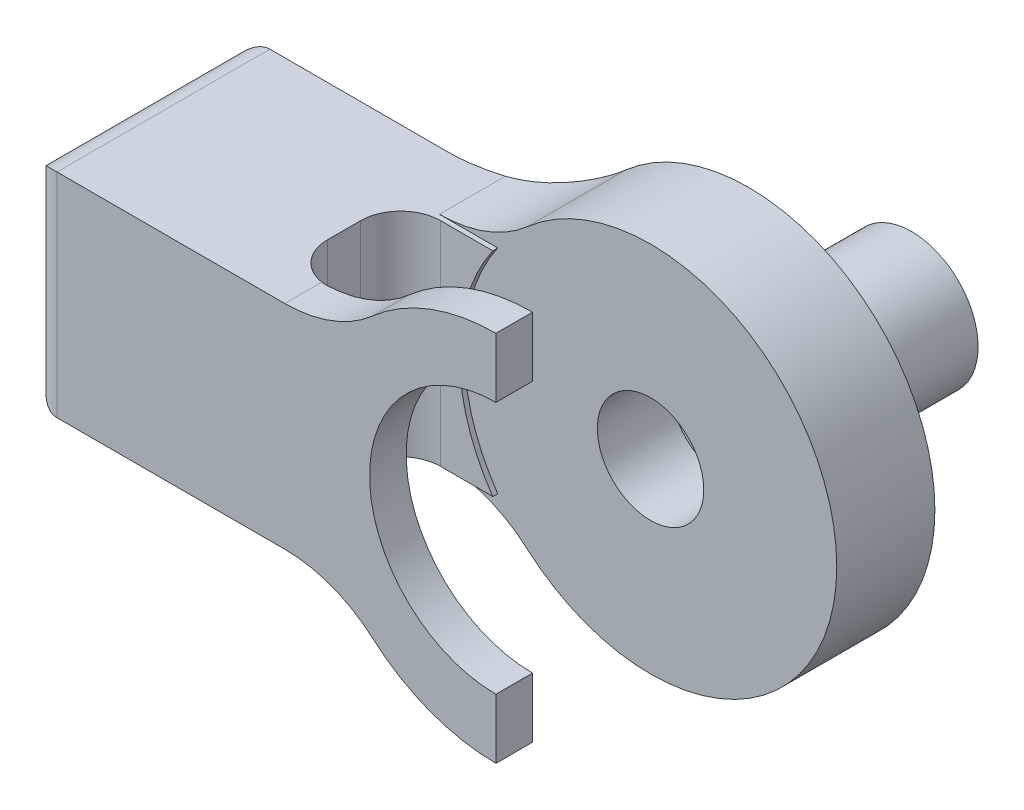
ISO-10303-21;
HEADER;
FILE_DESCRIPTION(('STEP AP214'),'2;1');
FILE_NAME('part.step','',(''),(''),'','','');
FILE_SCHEMA(('AUTOMOTIVE_DESIGN { 1 0 10303 214 1 1 1 1 }'));
ENDSEC;
DATA;
#1=APPLICATION_CONTEXT('core data for automotive mechanical design processes');
#2=APPLICATION_PROTOCOL_DEFINITION('international standard','automotive_design',2000,#1);
#3=PRODUCT_CONTEXT('',#1,'mechanical');
#4=PRODUCT('Part','Part','',(#3));
#5=PRODUCT_RELATED_PRODUCT_CATEGORY('part','',(#4));
#6=PRODUCT_DEFINITION_FORMATION('','',#4);
#7=PRODUCT_DEFINITION_CONTEXT('part definition',#1,'design');
#8=PRODUCT_DEFINITION('design','',#6,#7);
#9=PRODUCT_DEFINITION_SHAPE('','',#8);
#10=(LENGTH_UNIT() NAMED_UNIT(*) SI_UNIT(.MILLI.,.METRE.));
#11=(NAMED_UNIT(*) PLANE_ANGLE_UNIT() SI_UNIT($,.RADIAN.));
#12=(NAMED_UNIT(*) SI_UNIT($,.STERADIAN.) SOLID_ANGLE_UNIT());
#13=UNCERTAINTY_MEASURE_WITH_UNIT(LENGTH_MEASURE(1.E-05),#10,'distance_accuracy_value','');
#14=(GEOMETRIC_REPRESENTATION_CONTEXT(3) GLOBAL_UNCERTAINTY_ASSIGNED_CONTEXT((#13)) GLOBAL_UNIT_ASSIGNED_CONTEXT((#10,
#11,#12)) REPRESENTATION_CONTEXT('',''));
#15=CARTESIAN_POINT('',(0.,0.,0.));
#16=DIRECTION('',(0.,0.,1.));
#17=DIRECTION('',(1.,0.,0.));
#18=AXIS2_PLACEMENT_3D('',#15,#16,#17);
#19=CARTESIAN_POINT('',(0.,0.,-3.75));
#20=DIRECTION('',(0.,0.,1.));
#21=DIRECTION('',(1.,0.,0.));
#22=AXIS2_PLACEMENT_3D('',#19,#20,#21);
#23=CYLINDRICAL_SURFACE('',#22,13.9999986977378);
#24=DIRECTION('',(0.,0.,1.));
#25=VECTOR('',#24,1.);
#26=CARTESIAN_POINT('',(-9.26012808133646,-10.499999593043,-3.75));
#27=LINE('',#26,#25);
#28=CARTESIAN_POINT('',(-9.26012808133646,-10.499999593043,3.62689200329125));
#29=VERTEX_POINT('',#28);
#30=CARTESIAN_POINT('',(-9.26012808133646,-10.499999593043,-3.75));
#31=VERTEX_POINT('',#30);
#32=EDGE_CURVE('E364',#29,#31,#27,.F.);
#33=ORIENTED_EDGE('',*,*,#32,.T.);
#34=CARTESIAN_POINT('',(0.,0.,-3.75));
#35=DIRECTION('',(0.,0.,-1.));
#36=DIRECTION('',(-1.,0.,0.));
#37=AXIS2_PLACEMENT_3D('',#34,#35,#36);
#38=CIRCLE('',#37,13.9999986977378);
#39=CARTESIAN_POINT('',(-9.26012808133646,10.499999593043,-3.75));
#40=VERTEX_POINT('',#39);
#41=EDGE_CURVE('E335',#40,#31,#38,.T.);
#42=ORIENTED_EDGE('',*,*,#41,.F.);
#43=DIRECTION('',(0.,0.,1.));
#44=VECTOR('',#43,1.);
#45=CARTESIAN_POINT('',(-9.26012808133646,10.499999593043,-3.75));
#46=LINE('',#45,#44);
#47=CARTESIAN_POINT('',(-9.26012808133646,10.499999593043,3.62689200329125));
#48=VERTEX_POINT('',#47);
#49=EDGE_CURVE('E362',#40,#48,#46,.T.);
#50=ORIENTED_EDGE('',*,*,#49,.T.);
#51=CARTESIAN_POINT('',(0.,0.,3.62689200329125));
#52=DIRECTION('',(0.,0.,1.));
#53=DIRECTION('',(0.,-1.,0.));
#54=AXIS2_PLACEMENT_3D('',#51,#52,#53);
#55=CIRCLE('',#54,13.9999986977378);
#56=EDGE_CURVE('E332',#48,#29,#55,.F.);
#57=ORIENTED_EDGE('',*,*,#56,.T.);
#58=EDGE_LOOP('',(#33,#42,#50,#57));
#59=FACE_BOUND('',#58,.T.);
#60=ADVANCED_FACE('F34',(#59),#23,.T.);
#61=CARTESIAN_POINT('',(0.,0.,-16.));
#62=DIRECTION('',(0.,0.,1.));
#63=DIRECTION('',(1.,0.,0.));
#64=AXIS2_PLACEMENT_3D('',#61,#62,#63);
#65=CYLINDRICAL_SURFACE('',#64,5.);
#66=CARTESIAN_POINT('',(0.,0.,-5.75000000000001));
#67=DIRECTION('',(0.,0.,-1.));
#68=DIRECTION('',(-1.,0.,0.));
#69=AXIS2_PLACEMENT_3D('',#66,#67,#68);
#70=CIRCLE('',#69,5.);
#71=CARTESIAN_POINT('',(-5.,0.,-5.75000000000001));
#72=VERTEX_POINT('',#71);
#73=EDGE_CURVE('E416',#72,#72,#70,.T.);
#74=ORIENTED_EDGE('',*,*,#73,.T.);
#75=EDGE_LOOP('',(#74));
#76=FACE_BOUND('',#75,.T.);
#77=CARTESIAN_POINT('',(0.,0.,-16.));
#78=DIRECTION('',(0.,0.,-1.));
#79=DIRECTION('',(-1.,0.,0.));
#80=AXIS2_PLACEMENT_3D('',#77,#78,#79);
#81=CIRCLE('',#80,5.);
#82=CARTESIAN_POINT('',(-5.,0.,-16.));
#83=VERTEX_POINT('',#82);
#84=EDGE_CURVE('E351',#83,#83,#81,.T.);
#85=ORIENTED_EDGE('',*,*,#84,.F.);
#86=EDGE_LOOP('',(#85));
#87=FACE_BOUND('',#86,.T.);
#88=ADVANCED_FACE('F461',(#76,#87),#65,.T.);
#89=CARTESIAN_POINT('',(0.,0.,-16.));
#90=DIRECTION('',(0.,0.,-1.));
#91=DIRECTION('',(-1.,0.,0.));
#92=AXIS2_PLACEMENT_3D('',#89,#90,#91);
#93=PLANE('',#92);
#94=ORIENTED_EDGE('',*,*,#84,.T.);
#95=EDGE_LOOP('',(#94));
#96=FACE_BOUND('',#95,.T.);
#97=DIRECTION('',(0.707106781186548,0.707106781186548,0.));
#98=VECTOR('',#97,1.);
#99=CARTESIAN_POINT('',(0.,3.,-16.));
#100=LINE('',#99,#98);
#101=CARTESIAN_POINT('',(-3.,0.,-16.));
#102=VERTEX_POINT('',#101);
#103=CARTESIAN_POINT('',(0.,3.,-16.));
#104=VERTEX_POINT('',#103);
#105=EDGE_CURVE('E344',#102,#104,#100,.T.);
#106=ORIENTED_EDGE('',*,*,#105,.F.);
#107=CARTESIAN_POINT('',(0.,0.,-16.));
#108=DIRECTION('',(0.,0.,-1.));
#109=DIRECTION('',(-1.,0.,0.));
#110=AXIS2_PLACEMENT_3D('',#107,#108,#109);
#111=CIRCLE('',#110,3.);
#112=EDGE_CURVE('E341',#104,#102,#111,.T.);
#113=ORIENTED_EDGE('',*,*,#112,.F.);
#114=EDGE_LOOP('',(#106,#113));
#115=FACE_BOUND('',#114,.T.);
#116=ADVANCED_FACE('F467',(#96,#115),#93,.T.);
#117=CARTESIAN_POINT('',(0.,3.,-16.));
#118=DIRECTION('',(0.707106781186547,-0.707106781186547,0.));
#119=DIRECTION('',(0.707106781186548,0.707106781186548,0.));
#120=AXIS2_PLACEMENT_3D('',#117,#118,#119);
#121=PLANE('',#120);
#122=DIRECTION('',(0.707106781186548,0.707106781186548,0.));
#123=VECTOR('',#122,1.);
#124=CARTESIAN_POINT('',(0.,3.,-3.75));
#125=LINE('',#124,#123);
#126=CARTESIAN_POINT('',(-3.,0.,-3.75));
#127=VERTEX_POINT('',#126);
#128=CARTESIAN_POINT('',(0.,3.,-3.75));
#129=VERTEX_POINT('',#128);
#130=EDGE_CURVE('E338',#127,#129,#125,.T.);
#131=ORIENTED_EDGE('',*,*,#130,.F.);
#132=DIRECTION('',(0.,0.,1.));
#133=VECTOR('',#132,1.);
#134=CARTESIAN_POINT('',(-3.,0.,-16.));
#135=LINE('',#134,#133);
#136=EDGE_CURVE('E349',#102,#127,#135,.T.);
#137=ORIENTED_EDGE('',*,*,#136,.F.);
#138=ORIENTED_EDGE('',*,*,#105,.T.);
#139=DIRECTION('',(0.,0.,1.));
#140=VECTOR('',#139,1.);
#141=CARTESIAN_POINT('',(0.,3.,-16.));
#142=LINE('',#141,#140);
#143=EDGE_CURVE('E346',#104,#129,#142,.T.);
#144=ORIENTED_EDGE('',*,*,#143,.T.);
#145=EDGE_LOOP('',(#131,#137,#138,#144));
#146=FACE_BOUND('',#145,.T.);
#147=ADVANCED_FACE('F463',(#146),#121,.T.);
#148=CARTESIAN_POINT('',(0.,0.,-16.));
#149=DIRECTION('',(0.,0.,1.));
#150=DIRECTION('',(1.,0.,0.));
#151=AXIS2_PLACEMENT_3D('',#148,#149,#150);
#152=CYLINDRICAL_SURFACE('',#151,3.);
#153=CARTESIAN_POINT('',(0.,0.,-3.75));
#154=DIRECTION('',(0.,0.,-1.));
#155=DIRECTION('',(-1.,0.,0.));
#156=AXIS2_PLACEMENT_3D('',#153,#154,#155);
#157=CIRCLE('',#156,3.);
#158=EDGE_CURVE('E354',#129,#127,#157,.T.);
#159=ORIENTED_EDGE('',*,*,#158,.F.);
#160=ORIENTED_EDGE('',*,*,#143,.F.);
#161=ORIENTED_EDGE('',*,*,#112,.T.);
#162=ORIENTED_EDGE('',*,*,#136,.T.);
#163=EDGE_LOOP('',(#159,#160,#161,#162));
#164=FACE_BOUND('',#163,.T.);
#165=ADVANCED_FACE('F466',(#164),#152,.F.);
#166=CARTESIAN_POINT('',(0.,0.,-3.75));
#167=DIRECTION('',(0.,0.,-1.));
#168=DIRECTION('',(-1.,0.,0.));
#169=AXIS2_PLACEMENT_3D('',#166,#167,#168);
#170=PLANE('',#169);
#171=ORIENTED_EDGE('',*,*,#158,.T.);
#172=ORIENTED_EDGE('',*,*,#130,.T.);
#173=EDGE_LOOP('',(#171,#172));
#174=FACE_BOUND('',#173,.T.);
#175=ADVANCED_FACE('F457',(#174),#170,.T.);
#176=CARTESIAN_POINT('',(0.,0.,-3.75));
#177=DIRECTION('',(0.,0.,-1.));
#178=DIRECTION('',(-1.,0.,0.));
#179=AXIS2_PLACEMENT_3D('',#176,#177,#178);
#180=CIRCLE('',#179,7.);
#181=CARTESIAN_POINT('',(-7.,0.,-3.75));
#182=VERTEX_POINT('',#181);
#183=EDGE_CURVE('E423',#182,#182,#180,.F.);
#184=ORIENTED_EDGE('',*,*,#183,.T.);
#185=EDGE_LOOP('',(#184));
#186=FACE_BOUND('',#185,.T.);
#187=ORIENTED_EDGE('',*,*,#41,.T.);
#188=EDGE_CURVE('E334',#31,#40,#38,.T.);
#189=ORIENTED_EDGE('',*,*,#188,.T.);
#190=EDGE_LOOP('',(#187,#189));
#191=FACE_BOUND('',#190,.T.);
#192=ADVANCED_FACE('F453',(#186,#191),#170,.T.);
#193=CARTESIAN_POINT('',(-1.11022302462516E-13,4.44089209850063E-13,3.62689200329125));
#194=DIRECTION('',(0.,0.,1.));
#195=DIRECTION('',(0.823405242214894,-0.567453792914482,0.));
#196=AXIS2_PLACEMENT_3D('',#193,#194,#195);
#197=PLANE('',#196);
#198=CARTESIAN_POINT('',(0.,0.,3.62689200329125));
#199=DIRECTION('',(0.,0.,1.));
#200=DIRECTION('',(1.,0.,0.));
#201=AXIS2_PLACEMENT_3D('',#198,#199,#200);
#202=CIRCLE('',#201,4.);
#203=CARTESIAN_POINT('',(4.,0.,3.62689200329125));
#204=VERTEX_POINT('',#203);
#205=EDGE_CURVE('E599',#204,#204,#202,.T.);
#206=ORIENTED_EDGE('',*,*,#205,.F.);
#207=EDGE_LOOP('',(#206));
#208=FACE_BOUND('',#207,.T.);
#209=CARTESIAN_POINT('',(-11.4891237062128,-7.99999999999999,3.62689200329125));
#210=VERTEX_POINT('',#209);
#211=CARTESIAN_POINT('',(-11.4891237062128,8.,3.62689200329125));
#212=VERTEX_POINT('',#211);
#213=EDGE_CURVE('E231',#210,#212,#55,.F.);
#214=ORIENTED_EDGE('',*,*,#213,.F.);
#215=DIRECTION('',(1.,0.,0.));
#216=VECTOR('',#215,1.);
#217=CARTESIAN_POINT('',(-1.11022302462516E-13,-8.,3.62689200329125));
#218=LINE('',#217,#216);
#219=CARTESIAN_POINT('',(-15.8745058975521,-8.,3.62689200329125));
#220=VERTEX_POINT('',#219);
#221=EDGE_CURVE('E357',#220,#210,#218,.T.);
#222=ORIENTED_EDGE('',*,*,#221,.F.);
#223=CARTESIAN_POINT('',(-15.8745058975521,-18.,3.62689200329125));
#224=DIRECTION('',(0.,0.,1.));
#225=DIRECTION('',(0.,-1.,0.));
#226=AXIS2_PLACEMENT_3D('',#223,#224,#225);
#227=CIRCLE('',#226,10.);
#228=EDGE_CURVE('E370',#220,#29,#227,.F.);
#229=ORIENTED_EDGE('',*,*,#228,.T.);
#230=ORIENTED_EDGE('',*,*,#56,.F.);
#231=CARTESIAN_POINT('',(-15.8745058975521,18.,3.62689200329125));
#232=DIRECTION('',(0.,0.,1.));
#233=DIRECTION('',(0.,-1.,0.));
#234=AXIS2_PLACEMENT_3D('',#231,#232,#233);
#235=CIRCLE('',#234,10.);
#236=CARTESIAN_POINT('',(-15.8745058975521,8.,3.62689200329125));
#237=VERTEX_POINT('',#236);
#238=EDGE_CURVE('E372',#48,#237,#235,.F.);
#239=ORIENTED_EDGE('',*,*,#238,.T.);
#240=DIRECTION('',(-1.,0.,0.));
#241=VECTOR('',#240,1.);
#242=CARTESIAN_POINT('',(0.,8.,3.62689200329125));
#243=LINE('',#242,#241);
#244=EDGE_CURVE('E366',#212,#237,#243,.T.);
#245=ORIENTED_EDGE('',*,*,#244,.F.);
#246=EDGE_LOOP('',(#214,#222,#229,#230,#239,#245));
#247=FACE_BOUND('',#246,.T.);
#248=ADVANCED_FACE('F449',(#208,#247),#197,.T.);
#249=CARTESIAN_POINT('',(0.,-8.,-0.750000000000004));
#250=DIRECTION('',(0.,0.,-1.));
#251=DIRECTION('',(-1.,0.,0.));
#252=AXIS2_PLACEMENT_3D('',#249,#250,#251);
#253=PLANE('',#252);
#254=DIRECTION('',(-1.,0.,0.));
#255=VECTOR('',#254,1.);
#256=CARTESIAN_POINT('',(0.,8.,-0.750000000000004));
#257=LINE('',#256,#255);
#258=CARTESIAN_POINT('',(-19.5693623027383,8.,-0.75));
#259=VERTEX_POINT('',#258);
#260=CARTESIAN_POINT('',(-33.,8.,-0.749999999999997));
#261=VERTEX_POINT('',#260);
#262=EDGE_CURVE('E291',#259,#261,#257,.T.);
#263=ORIENTED_EDGE('',*,*,#262,.F.);
#264=CARTESIAN_POINT('',(0.,0.,-0.750000000000004));
#265=DIRECTION('',(0.,0.,-1.));
#266=DIRECTION('',(-1.,0.,0.));
#267=AXIS2_PLACEMENT_3D('',#264,#265,#266);
#268=CIRCLE('',#267,21.1414271262807);
#269=CARTESIAN_POINT('',(-19.5693623027383,-8.,-0.75));
#270=VERTEX_POINT('',#269);
#271=EDGE_CURVE('E374',#259,#270,#268,.F.);
#272=ORIENTED_EDGE('',*,*,#271,.T.);
#273=DIRECTION('',(-1.,0.,0.));
#274=VECTOR('',#273,1.);
#275=CARTESIAN_POINT('',(0.,-8.,-0.750000000000004));
#276=LINE('',#275,#274);
#277=CARTESIAN_POINT('',(-33.,-8.,-0.749999999999997));
#278=VERTEX_POINT('',#277);
#279=EDGE_CURVE('E272',#270,#278,#276,.T.);
#280=ORIENTED_EDGE('',*,*,#279,.T.);
#281=DIRECTION('',(0.,1.,0.));
#282=VECTOR('',#281,1.);
#283=CARTESIAN_POINT('',(-33.,-8.,-0.749999999999997));
#284=LINE('',#283,#282);
#285=EDGE_CURVE('E292',#278,#261,#284,.T.);
#286=ORIENTED_EDGE('',*,*,#285,.T.);
#287=EDGE_LOOP('',(#263,#272,#280,#286));
#288=FACE_BOUND('',#287,.T.);
#289=ADVANCED_FACE('F452',(#288),#253,.T.);
#290=CARTESIAN_POINT('',(-18.4192250558182,-8.,12.5));
#291=DIRECTION('',(1.,0.,0.));
#292=DIRECTION('',(0.,0.,-1.));
#293=AXIS2_PLACEMENT_3D('',#290,#291,#292);
#294=PLANE('',#293);
#295=DIRECTION('',(0.,0.,-1.));
#296=VECTOR('',#295,1.);
#297=CARTESIAN_POINT('',(-18.4192250558182,-8.,12.5));
#298=LINE('',#297,#296);
#299=CARTESIAN_POINT('',(-18.4192250558182,-8.,9.5));
#300=VERTEX_POINT('',#299);
#301=CARTESIAN_POINT('',(-18.4192250558182,-8.,7.));
#302=VERTEX_POINT('',#301);
#303=EDGE_CURVE('E289',#300,#302,#298,.T.);
#304=ORIENTED_EDGE('',*,*,#303,.T.);
#305=DIRECTION('',(0.,-1.,0.));
#306=VECTOR('',#305,1.);
#307=CARTESIAN_POINT('',(-18.4192250558182,8.,7.));
#308=LINE('',#307,#306);
#309=CARTESIAN_POINT('',(-18.4192250558182,8.,7.));
#310=VERTEX_POINT('',#309);
#311=EDGE_CURVE('E430',#302,#310,#308,.F.);
#312=ORIENTED_EDGE('',*,*,#311,.T.);
#313=DIRECTION('',(0.,0.,-1.));
#314=VECTOR('',#313,1.);
#315=CARTESIAN_POINT('',(-18.4192250558182,8.,12.5));
#316=LINE('',#315,#314);
#317=CARTESIAN_POINT('',(-18.4192250558182,8.,9.5));
#318=VERTEX_POINT('',#317);
#319=EDGE_CURVE('E314',#318,#310,#316,.T.);
#320=ORIENTED_EDGE('',*,*,#319,.F.);
#321=DIRECTION('',(0.,1.,0.));
#322=VECTOR('',#321,1.);
#323=CARTESIAN_POINT('',(-18.4192250558182,-8.,9.5));
#324=LINE('',#323,#322);
#325=EDGE_CURVE('E428',#318,#300,#324,.F.);
#326=ORIENTED_EDGE('',*,*,#325,.T.);
#327=EDGE_LOOP('',(#304,#312,#320,#326));
#328=FACE_BOUND('',#327,.T.);
#329=ADVANCED_FACE('F643',(#328),#294,.T.);
#330=CARTESIAN_POINT('',(0.,-8.,12.5));
#331=DIRECTION('',(0.,0.,-1.));
#332=DIRECTION('',(-1.,0.,0.));
#333=AXIS2_PLACEMENT_3D('',#330,#331,#332);
#334=PLANE('',#333);
#335=CARTESIAN_POINT('',(-15.8745058975521,-18.,12.5));
#336=DIRECTION('',(0.,0.,-1.));
#337=DIRECTION('',(-1.,0.,0.));
#338=AXIS2_PLACEMENT_3D('',#335,#336,#337);
#339=CIRCLE('',#338,10.);
#340=CARTESIAN_POINT('',(-9.26012808133646,-10.499999593043,12.5));
#341=VERTEX_POINT('',#340);
#342=CARTESIAN_POINT('',(-15.4192250558183,-8.0103694084741,12.5));
#343=VERTEX_POINT('',#342);
#344=EDGE_CURVE('E323',#341,#343,#339,.F.);
#345=ORIENTED_EDGE('',*,*,#344,.T.);
#346=DIRECTION('',(0.,1.,0.));
#347=VECTOR('',#346,1.);
#348=CARTESIAN_POINT('',(-15.4192250558183,8.,12.5));
#349=LINE('',#348,#347);
#350=CARTESIAN_POINT('',(-15.4192250558183,8.0103694084741,12.5));
#351=VERTEX_POINT('',#350);
#352=EDGE_CURVE('E432',#343,#351,#349,.T.);
#353=ORIENTED_EDGE('',*,*,#352,.T.);
#354=CARTESIAN_POINT('',(-15.8745058975521,18.,12.5));
#355=DIRECTION('',(0.,0.,-1.));
#356=DIRECTION('',(-1.,0.,0.));
#357=AXIS2_PLACEMENT_3D('',#354,#355,#356);
#358=CIRCLE('',#357,10.);
#359=CARTESIAN_POINT('',(-9.26012808133646,10.499999593043,12.5));
#360=VERTEX_POINT('',#359);
#361=EDGE_CURVE('E328',#351,#360,#358,.F.);
#362=ORIENTED_EDGE('',*,*,#361,.T.);
#363=CARTESIAN_POINT('',(0.,0.,12.5));
#364=DIRECTION('',(0.,0.,-1.));
#365=DIRECTION('',(-1.,0.,0.));
#366=AXIS2_PLACEMENT_3D('',#363,#364,#365);
#367=CIRCLE('',#366,13.9999986977378);
#368=CARTESIAN_POINT('',(0.,13.9999986977378,12.5));
#369=VERTEX_POINT('',#368);
#370=EDGE_CURVE('E263',#369,#360,#367,.F.);
#371=ORIENTED_EDGE('',*,*,#370,.F.);
#372=DIRECTION('',(0.,1.,0.));
#373=VECTOR('',#372,1.);
#374=CARTESIAN_POINT('',(0.,13.9999986977378,12.5));
#375=LINE('',#374,#373);
#376=CARTESIAN_POINT('',(0.,9.5,12.5));
#377=VERTEX_POINT('',#376);
#378=EDGE_CURVE('E244',#377,#369,#375,.T.);
#379=ORIENTED_EDGE('',*,*,#378,.F.);
#380=CARTESIAN_POINT('',(0.,0.,12.5));
#381=DIRECTION('',(0.,0.,-1.));
#382=DIRECTION('',(-1.,0.,0.));
#383=AXIS2_PLACEMENT_3D('',#380,#381,#382);
#384=CIRCLE('',#383,9.5);
#385=CARTESIAN_POINT('',(0.,-9.5,12.5));
#386=VERTEX_POINT('',#385);
#387=EDGE_CURVE('E254',#386,#377,#384,.T.);
#388=ORIENTED_EDGE('',*,*,#387,.F.);
#389=DIRECTION('',(0.,1.,0.));
#390=VECTOR('',#389,1.);
#391=CARTESIAN_POINT('',(0.,-9.5,12.5));
#392=LINE('',#391,#390);
#393=CARTESIAN_POINT('',(0.,-13.9999986977378,12.5));
#394=VERTEX_POINT('',#393);
#395=EDGE_CURVE('E259',#394,#386,#392,.T.);
#396=ORIENTED_EDGE('',*,*,#395,.F.);
#397=EDGE_CURVE('E266',#341,#394,#367,.F.);
#398=ORIENTED_EDGE('',*,*,#397,.F.);
#399=EDGE_LOOP('',(#345,#353,#362,#371,#379,#388,#396,#398));
#400=FACE_BOUND('',#399,.T.);
#401=ADVANCED_FACE('F402',(#400),#334,.T.);
#402=CARTESIAN_POINT('',(-35.,-8.,15.25));
#403=DIRECTION('',(0.,0.,1.));
#404=DIRECTION('',(1.,0.,0.));
#405=AXIS2_PLACEMENT_3D('',#402,#403,#404);
#406=PLANE('',#405);
#407=DIRECTION('',(1.,0.,0.));
#408=VECTOR('',#407,1.);
#409=CARTESIAN_POINT('',(-35.,-8.,15.25));
#410=LINE('',#409,#408);
#411=CARTESIAN_POINT('',(-33.,-8.,15.25));
#412=VERTEX_POINT('',#411);
#413=CARTESIAN_POINT('',(-15.8745058975521,-8.,15.25));
#414=VERTEX_POINT('',#413);
#415=EDGE_CURVE('E288',#412,#414,#410,.T.);
#416=ORIENTED_EDGE('',*,*,#415,.T.);
#417=CARTESIAN_POINT('',(-15.8745058975521,-18.,15.25));
#418=DIRECTION('',(0.,0.,1.));
#419=DIRECTION('',(1.,0.,0.));
#420=AXIS2_PLACEMENT_3D('',#417,#418,#419);
#421=CIRCLE('',#420,10.);
#422=CARTESIAN_POINT('',(-9.26012808133646,-10.499999593043,15.25));
#423=VERTEX_POINT('',#422);
#424=EDGE_CURVE('E326',#414,#423,#421,.F.);
#425=ORIENTED_EDGE('',*,*,#424,.T.);
#426=CARTESIAN_POINT('',(0.,0.,15.25));
#427=DIRECTION('',(0.,0.,1.));
#428=DIRECTION('',(1.,0.,0.));
#429=AXIS2_PLACEMENT_3D('',#426,#427,#428);
#430=CIRCLE('',#429,13.9999986977378);
#431=CARTESIAN_POINT('',(0.,-13.9999986977378,15.25));
#432=VERTEX_POINT('',#431);
#433=EDGE_CURVE('E248',#423,#432,#430,.T.);
#434=ORIENTED_EDGE('',*,*,#433,.T.);
#435=DIRECTION('',(0.,1.,0.));
#436=VECTOR('',#435,1.);
#437=CARTESIAN_POINT('',(0.,-9.5,15.25));
#438=LINE('',#437,#436);
#439=CARTESIAN_POINT('',(0.,-9.5,15.25));
#440=VERTEX_POINT('',#439);
#441=EDGE_CURVE('E241',#432,#440,#438,.T.);
#442=ORIENTED_EDGE('',*,*,#441,.T.);
#443=CARTESIAN_POINT('',(0.,0.,15.25));
#444=DIRECTION('',(0.,0.,-1.));
#445=DIRECTION('',(1.,0.,0.));
#446=AXIS2_PLACEMENT_3D('',#443,#444,#445);
#447=CIRCLE('',#446,9.5);
#448=CARTESIAN_POINT('',(0.,9.5,15.25));
#449=VERTEX_POINT('',#448);
#450=EDGE_CURVE('E232',#440,#449,#447,.T.);
#451=ORIENTED_EDGE('',*,*,#450,.T.);
#452=DIRECTION('',(0.,1.,0.));
#453=VECTOR('',#452,1.);
#454=CARTESIAN_POINT('',(0.,13.9999986977378,15.25));
#455=LINE('',#454,#453);
#456=CARTESIAN_POINT('',(0.,13.9999986977378,15.25));
#457=VERTEX_POINT('',#456);
#458=EDGE_CURVE('E236',#449,#457,#455,.T.);
#459=ORIENTED_EDGE('',*,*,#458,.T.);
#460=CARTESIAN_POINT('',(-9.26012808133646,10.499999593043,15.25));
#461=VERTEX_POINT('',#460);
#462=EDGE_CURVE('E245',#457,#461,#430,.T.);
#463=ORIENTED_EDGE('',*,*,#462,.T.);
#464=CARTESIAN_POINT('',(-15.8745058975521,18.,15.25));
#465=DIRECTION('',(0.,0.,1.));
#466=DIRECTION('',(1.,0.,0.));
#467=AXIS2_PLACEMENT_3D('',#464,#465,#466);
#468=CIRCLE('',#467,10.);
#469=CARTESIAN_POINT('',(-15.8745058975521,8.,15.25));
#470=VERTEX_POINT('',#469);
#471=EDGE_CURVE('E330',#461,#470,#468,.F.);
#472=ORIENTED_EDGE('',*,*,#471,.T.);
#473=DIRECTION('',(1.,0.,0.));
#474=VECTOR('',#473,1.);
#475=CARTESIAN_POINT('',(-35.,8.,15.25));
#476=LINE('',#475,#474);
#477=CARTESIAN_POINT('',(-33.,8.,15.25));
#478=VERTEX_POINT('',#477);
#479=EDGE_CURVE('E298',#478,#470,#476,.T.);
#480=ORIENTED_EDGE('',*,*,#479,.F.);
#481=DIRECTION('',(0.,1.,0.));
#482=VECTOR('',#481,1.);
#483=CARTESIAN_POINT('',(-33.,-8.,15.25));
#484=LINE('',#483,#482);
#485=EDGE_CURVE('E286',#478,#412,#484,.F.);
#486=ORIENTED_EDGE('',*,*,#485,.T.);
#487=EDGE_LOOP('',(#416,#425,#434,#442,#451,#459,#463,#472,#480,#486));
#488=FACE_BOUND('',#487,.T.);
#489=ADVANCED_FACE('F528',(#488),#406,.T.);
#490=CARTESIAN_POINT('',(-35.,-8.,-0.749999999999997));
#491=DIRECTION('',(-1.,0.,0.));
#492=DIRECTION('',(0.,0.,1.));
#493=AXIS2_PLACEMENT_3D('',#490,#491,#492);
#494=PLANE('',#493);
#495=DIRECTION('',(0.,1.,0.));
#496=VECTOR('',#495,1.);
#497=CARTESIAN_POINT('',(-35.,-8.,1.25));
#498=LINE('',#497,#496);
#499=CARTESIAN_POINT('',(-35.,6.,1.25));
#500=VERTEX_POINT('',#499);
#501=CARTESIAN_POINT('',(-35.,-6.,1.25));
#502=VERTEX_POINT('',#501);
#503=EDGE_CURVE('E304',#500,#502,#498,.F.);
#504=ORIENTED_EDGE('',*,*,#503,.T.);
#505=DIRECTION('',(0.,0.,1.));
#506=VECTOR('',#505,1.);
#507=CARTESIAN_POINT('',(-35.,-6.,-0.749999999999997));
#508=LINE('',#507,#506);
#509=CARTESIAN_POINT('',(-35.,-6.,13.25));
#510=VERTEX_POINT('',#509);
#511=EDGE_CURVE('E300',#502,#510,#508,.T.);
#512=ORIENTED_EDGE('',*,*,#511,.T.);
#513=DIRECTION('',(0.,1.,0.));
#514=VECTOR('',#513,1.);
#515=CARTESIAN_POINT('',(-35.,-8.,13.25));
#516=LINE('',#515,#514);
#517=CARTESIAN_POINT('',(-35.,6.,13.25));
#518=VERTEX_POINT('',#517);
#519=EDGE_CURVE('E303',#510,#518,#516,.T.);
#520=ORIENTED_EDGE('',*,*,#519,.T.);
#521=DIRECTION('',(0.,0.,1.));
#522=VECTOR('',#521,1.);
#523=CARTESIAN_POINT('',(-35.,6.,-0.749999999999997));
#524=LINE('',#523,#522);
#525=EDGE_CURVE('E299',#518,#500,#524,.F.);
#526=ORIENTED_EDGE('',*,*,#525,.T.);
#527=EDGE_LOOP('',(#504,#512,#520,#526));
#528=FACE_BOUND('',#527,.T.);
#529=ADVANCED_FACE('F400',(#528),#494,.T.);
#530=CARTESIAN_POINT('',(0.,-8.,0.));
#531=DIRECTION('',(0.,-1.,0.));
#532=DIRECTION('',(0.,0.,-1.));
#533=AXIS2_PLACEMENT_3D('',#530,#531,#532);
#534=PLANE('',#533);
#535=ORIENTED_EDGE('',*,*,#279,.F.);
#536=CARTESIAN_POINT('',(-19.5693623027383,-8.,-0.75));
#537=CARTESIAN_POINT('',(-19.2553984307283,-8.,-0.749976758082825));
#538=CARTESIAN_POINT('',(-18.9414817191194,-8.,-0.762667563527441));
#539=CARTESIAN_POINT('',(-18.3174741936029,-8.,-0.812621328299795));
#540=CARTESIAN_POINT('',(-18.0073717317587,-8.,-0.849738313450334));
#541=CARTESIAN_POINT('',(-17.391050337431,-8.,-0.947691600440961));
#542=CARTESIAN_POINT('',(-17.0848303069907,-8.,-1.00852103457618));
#543=CARTESIAN_POINT('',(-16.4760231844498,-8.,-1.15348709911085));
#544=CARTESIAN_POINT('',(-16.1734685944069,-8.,-1.23776039380023));
#545=CARTESIAN_POINT('',(-15.8745058975521,-8.,-1.33317965218795));
#546=B_SPLINE_CURVE_WITH_KNOTS('',3,(#536,#537,#538,#539,#540,#541,#542,#543,#544,#545),
.UNSPECIFIED.,.F.,.F.,(4,2,2,2,4),(0.,0.94156681118043,1.87755717566681,2.8132766556322,
3.75456946680079),.UNSPECIFIED.);
#547=CARTESIAN_POINT('',(-15.8745058975521,-8.,-1.33317965218795));
#548=VERTEX_POINT('',#547);
#549=EDGE_CURVE('E377',#270,#548,#546,.T.);
#550=ORIENTED_EDGE('',*,*,#549,.T.);
#551=DIRECTION('',(0.,0.,1.));
#552=VECTOR('',#551,1.);
#553=CARTESIAN_POINT('',(-15.8745058975521,-8.,0.));
#554=LINE('',#553,#552);
#555=EDGE_CURVE('E359',#548,#220,#554,.T.);
#556=ORIENTED_EDGE('',*,*,#555,.T.);
#557=ORIENTED_EDGE('',*,*,#221,.T.);
#558=DIRECTION('',(0.,0.,-1.));
#559=VECTOR('',#558,1.);
#560=CARTESIAN_POINT('',(-11.4891237062128,-7.99999999999999,4.));
#561=LINE('',#560,#559);
#562=CARTESIAN_POINT('',(-11.4891237062128,-7.99999999999999,4.));
#563=VERTEX_POINT('',#562);
#564=EDGE_CURVE('E233',#563,#210,#561,.T.);
#565=ORIENTED_EDGE('',*,*,#564,.F.);
#566=DIRECTION('',(1.,0.,0.));
#567=VECTOR('',#566,1.);
#568=CARTESIAN_POINT('',(-18.4192250558182,-8.,4.));
#569=LINE('',#568,#567);
#570=CARTESIAN_POINT('',(-15.4192250558183,-8.,4.));
#571=VERTEX_POINT('',#570);
#572=EDGE_CURVE('E218',#571,#563,#569,.T.);
#573=ORIENTED_EDGE('',*,*,#572,.F.);
#574=CARTESIAN_POINT('',(-15.4192250558183,-8.,7.));
#575=DIRECTION('',(0.,-1.,0.));
#576=DIRECTION('',(0.,0.,-1.));
#577=AXIS2_PLACEMENT_3D('',#574,#575,#576);
#578=CIRCLE('',#577,3.);
#579=EDGE_CURVE('E435',#571,#302,#578,.F.);
#580=ORIENTED_EDGE('',*,*,#579,.T.);
#581=ORIENTED_EDGE('',*,*,#303,.F.);
#582=CARTESIAN_POINT('',(-15.4192250558183,-8.,9.5));
#583=DIRECTION('',(0.,-1.,0.));
#584=DIRECTION('',(0.,0.,-1.));
#585=AXIS2_PLACEMENT_3D('',#582,#583,#584);
#586=CIRCLE('',#585,3.);
#587=CARTESIAN_POINT('',(-15.8745058975521,-8.,12.4652519884742));
#588=VERTEX_POINT('',#587);
#589=EDGE_CURVE('E47',#300,#588,#586,.F.);
#590=ORIENTED_EDGE('',*,*,#589,.T.);
#591=DIRECTION('',(0.,0.,-1.));
#592=VECTOR('',#591,1.);
#593=CARTESIAN_POINT('',(-15.8745058975521,-8.,15.25));
#594=LINE('',#593,#592);
#595=EDGE_CURVE('E53',#588,#414,#594,.F.);
#596=ORIENTED_EDGE('',*,*,#595,.T.);
#597=ORIENTED_EDGE('',*,*,#415,.F.);
#598=DIRECTION('',(0.,0.,1.));
#599=VECTOR('',#598,1.);
#600=CARTESIAN_POINT('',(-33.,-8.,0.));
#601=LINE('',#600,#599);
#602=EDGE_CURVE('E295',#412,#278,#601,.F.);
#603=ORIENTED_EDGE('',*,*,#602,.T.);
#604=EDGE_LOOP('',(#535,#550,#556,#557,#565,#573,#580,#581,#590,#596,#597,#603));
#605=FACE_BOUND('',#604,.T.);
#606=ADVANCED_FACE('F395',(#605),#534,.T.);
#607=CARTESIAN_POINT('',(0.,8.,0.));
#608=DIRECTION('',(0.,-1.,0.));
#609=DIRECTION('',(0.,0.,-1.));
#610=AXIS2_PLACEMENT_3D('',#607,#608,#609);
#611=PLANE('',#610);
#612=ORIENTED_EDGE('',*,*,#244,.T.);
#613=DIRECTION('',(0.,0.,-1.));
#614=VECTOR('',#613,1.);
#615=CARTESIAN_POINT('',(-15.8745058975521,8.,-0.750000000000001));
#616=LINE('',#615,#614);
#617=CARTESIAN_POINT('',(-15.8745058975521,8.,-1.33317965218795));
#618=VERTEX_POINT('',#617);
#619=EDGE_CURVE('E368',#237,#618,#616,.T.);
#620=ORIENTED_EDGE('',*,*,#619,.T.);
#621=CARTESIAN_POINT('',(-15.8745058975521,8.,-1.33317965218795));
#622=CARTESIAN_POINT('',(-16.1734685944069,8.,-1.23776039380023));
#623=CARTESIAN_POINT('',(-16.4760231844498,8.,-1.15348709911085));
#624=CARTESIAN_POINT('',(-17.0848303069907,8.,-1.00852103457618));
#625=CARTESIAN_POINT('',(-17.391050337431,8.,-0.94769160044096));
#626=CARTESIAN_POINT('',(-18.0073717317587,8.,-0.849738313450333));
#627=CARTESIAN_POINT('',(-18.3174741936029,8.,-0.812621328299795));
#628=CARTESIAN_POINT('',(-18.9414817191194,8.,-0.76266756352744));
#629=CARTESIAN_POINT('',(-19.2553984307283,8.,-0.749976758082824));
#630=CARTESIAN_POINT('',(-19.5693623027383,8.,-0.75));
#631=B_SPLINE_CURVE_WITH_KNOTS('',3,(#621,#622,#623,#624,#625,#626,#627,#628,#629,#630),
.UNSPECIFIED.,.F.,.F.,(4,2,2,2,4),(0.,0.941292811168591,1.87701229113398,2.81300265562036,
3.75456946680079),.UNSPECIFIED.);
#632=EDGE_CURVE('E411',#618,#259,#631,.T.);
#633=ORIENTED_EDGE('',*,*,#632,.T.);
#634=ORIENTED_EDGE('',*,*,#262,.T.);
#635=DIRECTION('',(0.,0.,1.));
#636=VECTOR('',#635,1.);
#637=CARTESIAN_POINT('',(-33.,8.,15.25));
#638=LINE('',#637,#636);
#639=EDGE_CURVE('E277',#261,#478,#638,.T.);
#640=ORIENTED_EDGE('',*,*,#639,.T.);
#641=ORIENTED_EDGE('',*,*,#479,.T.);
#642=DIRECTION('',(0.,0.,1.));
#643=VECTOR('',#642,1.);
#644=CARTESIAN_POINT('',(-15.8745058975521,8.,0.));
#645=LINE('',#644,#643);
#646=CARTESIAN_POINT('',(-15.8745058975521,8.,12.4652519884742));
#647=VERTEX_POINT('',#646);
#648=EDGE_CURVE('E61',#470,#647,#645,.F.);
#649=ORIENTED_EDGE('',*,*,#648,.T.);
#650=CARTESIAN_POINT('',(-15.4192250558183,8.,9.5));
#651=DIRECTION('',(0.,-1.,0.));
#652=DIRECTION('',(0.,0.,-1.));
#653=AXIS2_PLACEMENT_3D('',#650,#651,#652);
#654=CIRCLE('',#653,3.);
#655=EDGE_CURVE('E443',#647,#318,#654,.T.);
#656=ORIENTED_EDGE('',*,*,#655,.T.);
#657=ORIENTED_EDGE('',*,*,#319,.T.);
#658=CARTESIAN_POINT('',(-15.4192250558183,8.,7.));
#659=DIRECTION('',(0.,-1.,0.));
#660=DIRECTION('',(0.,0.,-1.));
#661=AXIS2_PLACEMENT_3D('',#658,#659,#660);
#662=CIRCLE('',#661,3.);
#663=CARTESIAN_POINT('',(-15.4192250558183,8.,4.));
#664=VERTEX_POINT('',#663);
#665=EDGE_CURVE('E214',#310,#664,#662,.T.);
#666=ORIENTED_EDGE('',*,*,#665,.T.);
#667=DIRECTION('',(-1.,0.,0.));
#668=VECTOR('',#667,1.);
#669=CARTESIAN_POINT('',(-11.4891237062128,8.,4.));
#670=LINE('',#669,#668);
#671=CARTESIAN_POINT('',(-11.4891237062128,8.,4.));
#672=VERTEX_POINT('',#671);
#673=EDGE_CURVE('E205',#672,#664,#670,.T.);
#674=ORIENTED_EDGE('',*,*,#673,.F.);
#675=DIRECTION('',(0.,0.,-1.));
#676=VECTOR('',#675,1.);
#677=CARTESIAN_POINT('',(-11.4891237062128,8.,4.));
#678=LINE('',#677,#676);
#679=EDGE_CURVE('E210',#672,#212,#678,.T.);
#680=ORIENTED_EDGE('',*,*,#679,.T.);
#681=EDGE_LOOP('',(#612,#620,#633,#634,#640,#641,#649,#656,#657,#666,#674,#680));
#682=FACE_BOUND('',#681,.T.);
#683=ADVANCED_FACE('F208',(#682),#611,.F.);
#684=CARTESIAN_POINT('',(-33.,6.,0.));
#685=DIRECTION('',(0.,0.,-1.));
#686=DIRECTION('',(-1.,0.,0.));
#687=AXIS2_PLACEMENT_3D('',#684,#685,#686);
#688=CYLINDRICAL_SURFACE('',#687,2.);
#689=CARTESIAN_POINT('',(-33.,6.,13.25));
#690=DIRECTION('',(0.,0.707106781186547,-0.707106781186547));
#691=DIRECTION('',(0.,0.707106781186547,0.707106781186547));
#692=AXIS2_PLACEMENT_3D('',#689,#690,#691);
#693=ELLIPSE('',#692,2.82842712474619,2.);
#694=EDGE_CURVE('E276',#478,#518,#693,.F.);
#695=ORIENTED_EDGE('',*,*,#694,.F.);
#696=ORIENTED_EDGE('',*,*,#639,.F.);
#697=CARTESIAN_POINT('',(-33.,6.,1.25));
#698=DIRECTION('',(0.,-0.707106781186547,-0.707106781186547));
#699=DIRECTION('',(0.,0.707106781186547,-0.707106781186547));
#700=AXIS2_PLACEMENT_3D('',#697,#698,#699);
#701=ELLIPSE('',#700,2.82842712474619,2.);
#702=EDGE_CURVE('E273',#500,#261,#701,.T.);
#703=ORIENTED_EDGE('',*,*,#702,.F.);
#704=ORIENTED_EDGE('',*,*,#525,.F.);
#705=EDGE_LOOP('',(#695,#696,#703,#704));
#706=FACE_BOUND('',#705,.T.);
#707=ADVANCED_FACE('F406',(#706),#688,.T.);
#708=CARTESIAN_POINT('',(-33.,-8.,1.25));
#709=DIRECTION('',(0.,1.,0.));
#710=DIRECTION('',(0.,0.,1.));
#711=AXIS2_PLACEMENT_3D('',#708,#709,#710);
#712=CYLINDRICAL_SURFACE('',#711,2.);
#713=ORIENTED_EDGE('',*,*,#702,.T.);
#714=ORIENTED_EDGE('',*,*,#285,.F.);
#715=CARTESIAN_POINT('',(-33.,-6.,1.25));
#716=DIRECTION('',(0.,0.707106781186547,-0.707106781186547));
#717=DIRECTION('',(0.,0.707106781186547,0.707106781186547));
#718=AXIS2_PLACEMENT_3D('',#715,#716,#717);
#719=ELLIPSE('',#718,2.82842712474619,2.);
#720=EDGE_CURVE('E280',#502,#278,#719,.F.);
#721=ORIENTED_EDGE('',*,*,#720,.F.);
#722=ORIENTED_EDGE('',*,*,#503,.F.);
#723=EDGE_LOOP('',(#713,#714,#721,#722));
#724=FACE_BOUND('',#723,.T.);
#725=ADVANCED_FACE('F523',(#724),#712,.T.);
#726=CARTESIAN_POINT('',(-33.,-8.,13.25));
#727=DIRECTION('',(0.,1.,0.));
#728=DIRECTION('',(0.,0.,1.));
#729=AXIS2_PLACEMENT_3D('',#726,#727,#728);
#730=CYLINDRICAL_SURFACE('',#729,2.);
#731=ORIENTED_EDGE('',*,*,#694,.T.);
#732=ORIENTED_EDGE('',*,*,#519,.F.);
#733=CARTESIAN_POINT('',(-33.,-6.,13.25));
#734=DIRECTION('',(0.,0.707106781186547,0.707106781186547));
#735=DIRECTION('',(0.,0.707106781186547,-0.707106781186547));
#736=AXIS2_PLACEMENT_3D('',#733,#734,#735);
#737=ELLIPSE('',#736,2.82842712474619,2.);
#738=EDGE_CURVE('E283',#412,#510,#737,.F.);
#739=ORIENTED_EDGE('',*,*,#738,.F.);
#740=ORIENTED_EDGE('',*,*,#485,.F.);
#741=EDGE_LOOP('',(#731,#732,#739,#740));
#742=FACE_BOUND('',#741,.T.);
#743=ADVANCED_FACE('F516',(#742),#730,.T.);
#744=CARTESIAN_POINT('',(-33.,-6.,-0.749999999999997));
#745=DIRECTION('',(0.,0.,1.));
#746=DIRECTION('',(1.,0.,0.));
#747=AXIS2_PLACEMENT_3D('',#744,#745,#746);
#748=CYLINDRICAL_SURFACE('',#747,2.);
#749=ORIENTED_EDGE('',*,*,#720,.T.);
#750=ORIENTED_EDGE('',*,*,#602,.F.);
#751=ORIENTED_EDGE('',*,*,#738,.T.);
#752=ORIENTED_EDGE('',*,*,#511,.F.);
#753=EDGE_LOOP('',(#749,#750,#751,#752));
#754=FACE_BOUND('',#753,.T.);
#755=ADVANCED_FACE('F509',(#754),#748,.T.);
#756=CARTESIAN_POINT('',(0.,0.,-18.8049487730502));
#757=DIRECTION('',(0.,0.,1.));
#758=DIRECTION('',(1.,0.,0.));
#759=AXIS2_PLACEMENT_3D('',#756,#757,#758);
#760=CYLINDRICAL_SURFACE('',#759,13.9999986977378);
#761=ORIENTED_EDGE('',*,*,#370,.T.);
#762=DIRECTION('',(0.,0.,1.));
#763=VECTOR('',#762,1.);
#764=CARTESIAN_POINT('',(-9.26012808133646,10.499999593043,-18.8049487730502));
#765=LINE('',#764,#763);
#766=EDGE_CURVE('E321',#360,#461,#765,.T.);
#767=ORIENTED_EDGE('',*,*,#766,.T.);
#768=ORIENTED_EDGE('',*,*,#462,.F.);
#769=DIRECTION('',(0.,0.,1.));
#770=VECTOR('',#769,1.);
#771=CARTESIAN_POINT('',(0.,13.9999986977378,-18.8049487730502));
#772=LINE('',#771,#770);
#773=EDGE_CURVE('E253',#369,#457,#772,.T.);
#774=ORIENTED_EDGE('',*,*,#773,.F.);
#775=EDGE_LOOP('',(#761,#767,#768,#774));
#776=FACE_BOUND('',#775,.T.);
#777=ADVANCED_FACE('F562',(#776),#760,.T.);
#778=CARTESIAN_POINT('',(0.,13.9999986977378,-18.8049487730502));
#779=DIRECTION('',(1.,0.,0.));
#780=DIRECTION('',(0.,0.,-1.));
#781=AXIS2_PLACEMENT_3D('',#778,#779,#780);
#782=PLANE('',#781);
#783=DIRECTION('',(0.,0.,1.));
#784=VECTOR('',#783,1.);
#785=CARTESIAN_POINT('',(0.,9.5,-18.8049487730502));
#786=LINE('',#785,#784);
#787=EDGE_CURVE('E257',#377,#449,#786,.T.);
#788=ORIENTED_EDGE('',*,*,#787,.F.);
#789=ORIENTED_EDGE('',*,*,#378,.T.);
#790=ORIENTED_EDGE('',*,*,#773,.T.);
#791=ORIENTED_EDGE('',*,*,#458,.F.);
#792=EDGE_LOOP('',(#788,#789,#790,#791));
#793=FACE_BOUND('',#792,.T.);
#794=ADVANCED_FACE('F559',(#793),#782,.T.);
#795=ORIENTED_EDGE('',*,*,#433,.F.);
#796=DIRECTION('',(0.,0.,1.));
#797=VECTOR('',#796,1.);
#798=CARTESIAN_POINT('',(-9.26012808133646,-10.499999593043,-18.8049487730502));
#799=LINE('',#798,#797);
#800=EDGE_CURVE('E285',#423,#341,#799,.F.);
#801=ORIENTED_EDGE('',*,*,#800,.T.);
#802=ORIENTED_EDGE('',*,*,#397,.T.);
#803=DIRECTION('',(0.,0.,1.));
#804=VECTOR('',#803,1.);
#805=CARTESIAN_POINT('',(0.,-13.9999986977378,-18.8049487730502));
#806=LINE('',#805,#804);
#807=EDGE_CURVE('E262',#394,#432,#806,.T.);
#808=ORIENTED_EDGE('',*,*,#807,.T.);
#809=EDGE_LOOP('',(#795,#801,#802,#808));
#810=FACE_BOUND('',#809,.T.);
#811=ADVANCED_FACE('F548',(#810),#760,.T.);
#812=CARTESIAN_POINT('',(0.,-9.5,-18.8049487730502));
#813=DIRECTION('',(1.,0.,0.));
#814=DIRECTION('',(0.,0.,-1.));
#815=AXIS2_PLACEMENT_3D('',#812,#813,#814);
#816=PLANE('',#815);
#817=ORIENTED_EDGE('',*,*,#807,.F.);
#818=ORIENTED_EDGE('',*,*,#395,.T.);
#819=DIRECTION('',(0.,0.,1.));
#820=VECTOR('',#819,1.);
#821=CARTESIAN_POINT('',(0.,-9.5,-18.8049487730502));
#822=LINE('',#821,#820);
#823=EDGE_CURVE('E258',#386,#440,#822,.T.);
#824=ORIENTED_EDGE('',*,*,#823,.T.);
#825=ORIENTED_EDGE('',*,*,#441,.F.);
#826=EDGE_LOOP('',(#817,#818,#824,#825));
#827=FACE_BOUND('',#826,.T.);
#828=ADVANCED_FACE('F552',(#827),#816,.T.);
#829=CARTESIAN_POINT('',(0.,0.,-18.8049487730502));
#830=DIRECTION('',(0.,0.,1.));
#831=DIRECTION('',(1.,0.,0.));
#832=AXIS2_PLACEMENT_3D('',#829,#830,#831);
#833=CYLINDRICAL_SURFACE('',#832,9.5);
#834=ORIENTED_EDGE('',*,*,#823,.F.);
#835=ORIENTED_EDGE('',*,*,#387,.T.);
#836=ORIENTED_EDGE('',*,*,#787,.T.);
#837=ORIENTED_EDGE('',*,*,#450,.F.);
#838=EDGE_LOOP('',(#834,#835,#836,#837));
#839=FACE_BOUND('',#838,.T.);
#840=ADVANCED_FACE('F555',(#839),#833,.F.);
#841=CARTESIAN_POINT('',(-15.8745058975521,-18.,-18.8049487730502));
#842=DIRECTION('',(0.,0.,1.));
#843=DIRECTION('',(1.,0.,0.));
#844=AXIS2_PLACEMENT_3D('',#841,#842,#843);
#845=CYLINDRICAL_SURFACE('',#844,10.);
#846=ORIENTED_EDGE('',*,*,#424,.F.);
#847=ORIENTED_EDGE('',*,*,#595,.F.);
#848=CARTESIAN_POINT('',(-15.8745058975521,-8.,12.4652519884742));
#849=CARTESIAN_POINT('',(-15.7990277662824,-7.9999901862048,12.4768292530913));
#850=CARTESIAN_POINT('',(-15.7233486305029,-8.00084939668004,12.485513553027));
#851=CARTESIAN_POINT('',(-15.5715883499249,-8.00430586617142,12.4970962235355));
#852=CARTESIAN_POINT('',(-15.4955072051265,-8.00690312518753,12.4999945941085));
#853=CARTESIAN_POINT('',(-15.4192250558183,-8.01036940847407,12.5000000000001));
#854=B_SPLINE_CURVE_WITH_KNOTS('',3,(#848,#849,#850,#851,#852,#853),.UNSPECIFIED.,.F.,.F.,(4,2,
4),(0.,0.228541860723994,0.457083721445119),.UNSPECIFIED.);
#855=EDGE_CURVE('E11',#588,#343,#854,.T.);
#856=ORIENTED_EDGE('',*,*,#855,.T.);
#857=ORIENTED_EDGE('',*,*,#344,.F.);
#858=ORIENTED_EDGE('',*,*,#800,.F.);
#859=EDGE_LOOP('',(#846,#847,#856,#857,#858));
#860=FACE_BOUND('',#859,.T.);
#861=ADVANCED_FACE('F407',(#860),#845,.F.);
#862=CARTESIAN_POINT('',(-15.8745058975521,18.,-18.8049487730502));
#863=DIRECTION('',(0.,0.,1.));
#864=DIRECTION('',(1.,0.,0.));
#865=AXIS2_PLACEMENT_3D('',#862,#863,#864);
#866=CYLINDRICAL_SURFACE('',#865,10.);
#867=ORIENTED_EDGE('',*,*,#471,.F.);
#868=ORIENTED_EDGE('',*,*,#766,.F.);
#869=ORIENTED_EDGE('',*,*,#361,.F.);
#870=CARTESIAN_POINT('',(-15.4192250558183,8.0103694084741,12.5));
#871=CARTESIAN_POINT('',(-15.4955072051265,8.00690312518755,12.4999945941084));
#872=CARTESIAN_POINT('',(-15.5715883499249,8.00430586617143,12.4970962235355));
#873=CARTESIAN_POINT('',(-15.7233486305029,8.00084939668004,12.485513553027));
#874=CARTESIAN_POINT('',(-15.7990277662824,7.99999018620479,12.4768292530913));
#875=CARTESIAN_POINT('',(-15.8745058975521,8.,12.4652519884742));
#876=B_SPLINE_CURVE_WITH_KNOTS('',3,(#870,#871,#872,#873,#874,#875),.UNSPECIFIED.,.F.,.F.,(4,2,
4),(0.,0.228541860721132,0.457083721445129),.UNSPECIFIED.);
#877=EDGE_CURVE('E438',#351,#647,#876,.T.);
#878=ORIENTED_EDGE('',*,*,#877,.T.);
#879=ORIENTED_EDGE('',*,*,#648,.F.);
#880=EDGE_LOOP('',(#867,#868,#869,#878,#879));
#881=FACE_BOUND('',#880,.T.);
#882=ADVANCED_FACE('F444',(#881),#866,.F.);
#883=CARTESIAN_POINT('',(0.,0.,4.));
#884=DIRECTION('',(0.,0.,-1.));
#885=DIRECTION('',(-1.,0.,0.));
#886=AXIS2_PLACEMENT_3D('',#883,#884,#885);
#887=CYLINDRICAL_SURFACE('',#886,13.9999986977378);
#888=ORIENTED_EDGE('',*,*,#213,.T.);
#889=ORIENTED_EDGE('',*,*,#679,.F.);
#890=CARTESIAN_POINT('',(0.,0.,4.));
#891=DIRECTION('',(0.,0.,-1.));
#892=DIRECTION('',(1.,0.,0.));
#893=AXIS2_PLACEMENT_3D('',#890,#891,#892);
#894=CIRCLE('',#893,13.9999986977378);
#895=EDGE_CURVE('E219',#563,#672,#894,.T.);
#896=ORIENTED_EDGE('',*,*,#895,.F.);
#897=ORIENTED_EDGE('',*,*,#564,.T.);
#898=EDGE_LOOP('',(#888,#889,#896,#897));
#899=FACE_BOUND('',#898,.T.);
#900=ADVANCED_FACE('F229',(#899),#887,.F.);
#901=CARTESIAN_POINT('',(0.,0.,4.));
#902=DIRECTION('',(0.,0.,1.));
#903=DIRECTION('',(1.,0.,0.));
#904=AXIS2_PLACEMENT_3D('',#901,#902,#903);
#905=PLANE('',#904);
#906=ORIENTED_EDGE('',*,*,#673,.T.);
#907=DIRECTION('',(0.,-1.,0.));
#908=VECTOR('',#907,1.);
#909=CARTESIAN_POINT('',(-15.4192250558183,-8.,4.));
#910=LINE('',#909,#908);
#911=EDGE_CURVE('E426',#664,#571,#910,.T.);
#912=ORIENTED_EDGE('',*,*,#911,.T.);
#913=ORIENTED_EDGE('',*,*,#572,.T.);
#914=ORIENTED_EDGE('',*,*,#895,.T.);
#915=EDGE_LOOP('',(#906,#912,#913,#914));
#916=FACE_BOUND('',#915,.T.);
#917=ADVANCED_FACE('F222',(#916),#905,.T.);
#918=CARTESIAN_POINT('',(-15.8745058975521,-18.,-3.75));
#919=DIRECTION('',(0.,0.,1.));
#920=DIRECTION('',(1.,0.,0.));
#921=AXIS2_PLACEMENT_3D('',#918,#919,#920);
#922=CYLINDRICAL_SURFACE('',#921,10.);
#923=ORIENTED_EDGE('',*,*,#555,.F.);
#924=CARTESIAN_POINT('',(-15.8745058975521,-8.,-1.33317965218795));
#925=CARTESIAN_POINT('',(-15.727339360206,-8.00000138162281,-1.38013281343408));
#926=CARTESIAN_POINT('',(-15.5809097396703,-8.0032485467759,-1.42931683458854));
#927=CARTESIAN_POINT('',(-15.2897312208011,-8.01604914631812,-1.5315397884298));
#928=CARTESIAN_POINT('',(-15.1449817864481,-8.02560050992691,-1.58457745019741));
#929=CARTESIAN_POINT('',(-14.8574483814905,-8.05080913480603,-1.69386608285517));
#930=CARTESIAN_POINT('',(-14.7146622375131,-8.06645896704462,-1.75011307331526));
#931=CARTESIAN_POINT('',(-14.4309422168144,-8.10370819912548,-1.86524888483633));
#932=CARTESIAN_POINT('',(-14.2900084989766,-8.12530810586522,-1.92413793062074));
#933=CARTESIAN_POINT('',(-13.8647846400464,-8.19974874243985,-2.10603376554856));
#934=CARTESIAN_POINT('',(-13.5834073298976,-8.26175672528618,-2.23219630900948));
#935=CARTESIAN_POINT('',(-13.0279049159064,-8.40940359527417,-2.48661274226888));
#936=CARTESIAN_POINT('',(-12.7537803912465,-8.49504436344455,-2.61486679777435));
#937=CARTESIAN_POINT('',(-12.3090279595518,-8.6554077238075,-2.82072196433116));
#938=CARTESIAN_POINT('',(-12.1365801315868,-8.72300926454169,-2.89997534232247));
#939=CARTESIAN_POINT('',(-11.7938954129197,-8.86855541637478,-3.05367244903537));
#940=CARTESIAN_POINT('',(-11.6236583147071,-8.94649904889438,-3.12811663181825));
#941=CARTESIAN_POINT('',(-11.2870038270148,-9.11238673568702,-3.26848023031054));
#942=CARTESIAN_POINT('',(-11.1205651252947,-9.20021835043092,-3.33448025457182));
#943=CARTESIAN_POINT('',(-10.7899211462013,-9.38704448494029,-3.45540354593358));
#944=CARTESIAN_POINT('',(-10.6257148821829,-9.48603388096682,-3.51033186519619));
#945=CARTESIAN_POINT('',(-10.3598746993629,-9.65710539584983,-3.58797596543023));
#946=CARTESIAN_POINT('',(-10.2573335195165,-9.72577709135414,-3.61512386224099));
#947=CARTESIAN_POINT('',(-10.0538337569314,-9.86764761788395,-3.66254502904476));
#948=CARTESIAN_POINT('',(-9.95287462502778,-9.94084483231676,-3.68282073731533));
#949=CARTESIAN_POINT('',(-9.75172336805411,-10.0925619814252,-3.71590541632622));
#950=CARTESIAN_POINT('',(-9.65155672094251,-10.1711371354092,-3.72861760518115));
#951=CARTESIAN_POINT('',(-9.45376019828233,-10.3325090966911,-3.74570216105805));
#952=CARTESIAN_POINT('',(-9.35613343551057,-10.4153107468864,-3.75006473002655));
#953=CARTESIAN_POINT('',(-9.26012808133646,-10.499999593043,-3.75));
#954=B_SPLINE_CURVE_WITH_KNOTS('',3,(#924,#925,#926,#927,#928,#929,#930,#931,#932,#933,#934,
#935,#936,#937,#938,#939,#940,#941,#942,#943,#944,#945,#946,#947,#948,#949,#950,#951,#952,#953),
.UNSPECIFIED.,.F.,.F.,(4,2,2,2,2,2,2,2,2,2,2,2,2,2,4),(0.,0.463338523049986,0.926524926027635,
1.38914883970087,1.85181217732651,2.79431234360236,3.73688754891622,4.34101845545598,
4.94509223922141,5.54288340823951,6.14040117679274,6.51925022471587,6.89796471455923,
7.28142641356139,7.66533781927768),.UNSPECIFIED.);
#955=EDGE_CURVE('E385',#548,#31,#954,.T.);
#956=ORIENTED_EDGE('',*,*,#955,.T.);
#957=ORIENTED_EDGE('',*,*,#32,.F.);
#958=ORIENTED_EDGE('',*,*,#228,.F.);
#959=EDGE_LOOP('',(#923,#956,#957,#958));
#960=FACE_BOUND('',#959,.T.);
#961=ADVANCED_FACE('F477',(#960),#922,.F.);
#962=CARTESIAN_POINT('',(-15.8745058975521,18.,-3.75));
#963=DIRECTION('',(0.,0.,1.));
#964=DIRECTION('',(1.,0.,0.));
#965=AXIS2_PLACEMENT_3D('',#962,#963,#964);
#966=CYLINDRICAL_SURFACE('',#965,10.);
#967=ORIENTED_EDGE('',*,*,#238,.F.);
#968=ORIENTED_EDGE('',*,*,#49,.F.);
#969=CARTESIAN_POINT('',(-9.26012808133646,10.499999593043,-3.75));
#970=CARTESIAN_POINT('',(-9.32612654667232,10.44179160032,-3.75001080474422));
#971=CARTESIAN_POINT('',(-9.39288333736161,10.3844697859877,-3.74796708093122));
#972=CARTESIAN_POINT('',(-9.52772323294792,10.2717360485306,-3.73987013890624));
#973=CARTESIAN_POINT('',(-9.59580597876504,10.2163236192821,-3.73381799194913));
#974=CARTESIAN_POINT('',(-9.80135282373014,10.0534739051513,-3.70984997118944));
#975=CARTESIAN_POINT('',(-9.94055844078063,9.94903403201515,-3.68612118098312));
#976=CARTESIAN_POINT('',(-10.2200681053503,9.75037296249655,-3.62542725515519));
#977=CARTESIAN_POINT('',(-10.3603268783627,9.65602544285259,-3.58865925041232));
#978=CARTESIAN_POINT('',(-10.6431263061061,9.47586944217391,-3.50417080522462));
#979=CARTESIAN_POINT('',(-10.7856688240438,9.39006839378553,-3.45644094873451));
#980=CARTESIAN_POINT('',(-11.1549493671146,9.17994415599288,-3.32261161888777));
#981=CARTESIAN_POINT('',(-11.3829488256818,9.0618559539123,-3.23023503838559));
#982=CARTESIAN_POINT('',(-11.8427972119496,8.84521888384984,-3.03305978423193));
#983=CARTESIAN_POINT('',(-12.0746486767896,8.74668349603152,-2.92825261963529));
#984=CARTESIAN_POINT('',(-12.5447439433205,8.56726463093733,-2.71210070441821));
#985=CARTESIAN_POINT('',(-12.7830254074483,8.48653893782293,-2.60070780328274));
#986=CARTESIAN_POINT('',(-13.264770011645,8.34327243858754,-2.3777070553025));
#987=CARTESIAN_POINT('',(-13.5082307948707,8.28072354337809,-2.26609932638916));
#988=CARTESIAN_POINT('',(-13.926393333387,8.19001876691308,-2.08023691287241));
#989=CARTESIAN_POINT('',(-14.0996085715679,8.15718296300487,-2.00489878740604));
#990=CARTESIAN_POINT('',(-14.4489029651406,8.10055784262683,-1.85760411004657));
#991=CARTESIAN_POINT('',(-14.6249814764372,8.07676652016453,-1.78564681142011));
#992=CARTESIAN_POINT('',(-14.9784760024744,8.03865153821158,-1.64693196123041));
#993=CARTESIAN_POINT('',(-15.1558682581801,8.02424981838111,-1.58013571640768));
#994=CARTESIAN_POINT('',(-15.5132955114493,8.00492325239215,-1.45215418738988));
#995=CARTESIAN_POINT('',(-15.6933321289347,8.00000448215493,-1.3909725244629));
#996=CARTESIAN_POINT('',(-15.8745058975521,8.,-1.33317965218795));
#997=B_SPLINE_CURVE_WITH_KNOTS('',3,(#969,#970,#971,#972,#973,#974,#975,#976,#977,#978,#979,
#980,#981,#982,#983,#984,#985,#986,#987,#988,#989,#990,#991,#992,#993,#994,#995,#996),
.UNSPECIFIED.,.F.,.F.,(4,2,2,2,2,2,2,2,2,2,2,2,2,4),(0.,0.263935151038136,0.527799793605034,
1.05376714242663,1.57209984781692,2.0908794686214,2.90810606237338,3.7258941284202,
4.55065978113701,5.37505783032164,5.9499921501159,6.5247988796537,7.09476387670269,
7.66509394086542),.UNSPECIFIED.);
#998=EDGE_CURVE('E417',#40,#618,#997,.T.);
#999=ORIENTED_EDGE('',*,*,#998,.T.);
#1000=ORIENTED_EDGE('',*,*,#619,.F.);
#1001=EDGE_LOOP('',(#967,#968,#999,#1000));
#1002=FACE_BOUND('',#1001,.T.);
#1003=ADVANCED_FACE('F480',(#1002),#966,.F.);
#1004=CARTESIAN_POINT('',(0.,0.,-10.75));
#1005=DIRECTION('',(0.,0.,-1.));
#1006=DIRECTION('',(-1.,0.,0.));
#1007=AXIS2_PLACEMENT_3D('',#1004,#1005,#1006);
#1008=TOROIDAL_SURFACE('',#1007,21.1414271262807,10.);
#1009=ORIENTED_EDGE('',*,*,#998,.F.);
#1010=ORIENTED_EDGE('',*,*,#188,.F.);
#1011=ORIENTED_EDGE('',*,*,#955,.F.);
#1012=ORIENTED_EDGE('',*,*,#549,.F.);
#1013=ORIENTED_EDGE('',*,*,#271,.F.);
#1014=ORIENTED_EDGE('',*,*,#632,.F.);
#1015=EDGE_LOOP('',(#1009,#1010,#1011,#1012,#1013,#1014));
#1016=FACE_BOUND('',#1015,.T.);
#1017=ADVANCED_FACE('F391',(#1016),#1008,.F.);
#1018=CARTESIAN_POINT('',(0.,0.,-1.87310799670875));
#1019=DIRECTION('',(0.,0.,1.));
#1020=DIRECTION('',(1.,0.,0.));
#1021=AXIS2_PLACEMENT_3D('',#1018,#1019,#1020);
#1022=CYLINDRICAL_SURFACE('',#1021,4.);
#1023=CARTESIAN_POINT('',(0.,0.,-1.87310799670875));
#1024=DIRECTION('',(0.,0.,1.));
#1025=DIRECTION('',(1.,0.,0.));
#1026=AXIS2_PLACEMENT_3D('',#1023,#1024,#1025);
#1027=CIRCLE('',#1026,4.);
#1028=CARTESIAN_POINT('',(4.,0.,-1.87310799670875));
#1029=VERTEX_POINT('',#1028);
#1030=EDGE_CURVE('E227',#1029,#1029,#1027,.T.);
#1031=ORIENTED_EDGE('',*,*,#1030,.F.);
#1032=EDGE_LOOP('',(#1031));
#1033=FACE_BOUND('',#1032,.T.);
#1034=ORIENTED_EDGE('',*,*,#205,.T.);
#1035=EDGE_LOOP('',(#1034));
#1036=FACE_BOUND('',#1035,.T.);
#1037=ADVANCED_FACE('F488',(#1033,#1036),#1022,.F.);
#1038=CARTESIAN_POINT('',(0.,0.,-1.87310799670875));
#1039=DIRECTION('',(0.,0.,1.));
#1040=DIRECTION('',(1.,0.,0.));
#1041=AXIS2_PLACEMENT_3D('',#1038,#1039,#1040);
#1042=PLANE('',#1041);
#1043=ORIENTED_EDGE('',*,*,#1030,.T.);
#1044=EDGE_LOOP('',(#1043));
#1045=FACE_BOUND('',#1044,.T.);
#1046=ADVANCED_FACE('F587',(#1045),#1042,.T.);
#1047=CARTESIAN_POINT('',(0.,0.,-5.75000000000001));
#1048=DIRECTION('',(0.,0.,-1.));
#1049=DIRECTION('',(-1.,0.,0.));
#1050=AXIS2_PLACEMENT_3D('',#1047,#1048,#1049);
#1051=TOROIDAL_SURFACE('',#1050,7.,2.);
#1052=ORIENTED_EDGE('',*,*,#183,.F.);
#1053=EDGE_LOOP('',(#1052));
#1054=FACE_BOUND('',#1053,.T.);
#1055=ORIENTED_EDGE('',*,*,#73,.F.);
#1056=EDGE_LOOP('',(#1055));
#1057=FACE_BOUND('',#1056,.T.);
#1058=ADVANCED_FACE('F590',(#1054,#1057),#1051,.F.);
#1059=CARTESIAN_POINT('',(-15.4192250558183,0.,7.));
#1060=DIRECTION('',(0.,1.,0.));
#1061=DIRECTION('',(0.,0.,1.));
#1062=AXIS2_PLACEMENT_3D('',#1059,#1060,#1061);
#1063=CYLINDRICAL_SURFACE('',#1062,3.);
#1064=ORIENTED_EDGE('',*,*,#665,.F.);
#1065=ORIENTED_EDGE('',*,*,#311,.F.);
#1066=ORIENTED_EDGE('',*,*,#579,.F.);
#1067=ORIENTED_EDGE('',*,*,#911,.F.);
#1068=EDGE_LOOP('',(#1064,#1065,#1066,#1067));
#1069=FACE_BOUND('',#1068,.T.);
#1070=ADVANCED_FACE('F595',(#1069),#1063,.F.);
#1071=CARTESIAN_POINT('',(-15.4192250558183,-8.,9.5));
#1072=DIRECTION('',(0.,-1.,0.));
#1073=DIRECTION('',(0.,0.,-1.));
#1074=AXIS2_PLACEMENT_3D('',#1071,#1072,#1073);
#1075=CYLINDRICAL_SURFACE('',#1074,3.);
#1076=ORIENTED_EDGE('',*,*,#589,.F.);
#1077=ORIENTED_EDGE('',*,*,#325,.F.);
#1078=ORIENTED_EDGE('',*,*,#655,.F.);
#1079=ORIENTED_EDGE('',*,*,#877,.F.);
#1080=ORIENTED_EDGE('',*,*,#352,.F.);
#1081=ORIENTED_EDGE('',*,*,#855,.F.);
#1082=EDGE_LOOP('',(#1076,#1077,#1078,#1079,#1080,#1081));
#1083=FACE_BOUND('',#1082,.T.);
#1084=ADVANCED_FACE('F36',(#1083),#1075,.F.);
#1085=CLOSED_SHELL('',(#60,#88,#116,#147,#165,#175,#192,#248,#289,#329,#401,#489,#529,#606,#683,
#707,#725,#743,#755,#777,#794,#811,#828,#840,#861,#882,#900,#917,#961,#1003,#1017,#1037,#1046,
#1058,#1070,#1084));
#1086=MANIFOLD_SOLID_BREP('B2',#1085);
#1087=ADVANCED_BREP_SHAPE_REPRESENTATION('',(#18,#1086),#14);
#1088=SHAPE_DEFINITION_REPRESENTATION(#9,#1087);
ENDSEC;
END-ISO-10303-21;
